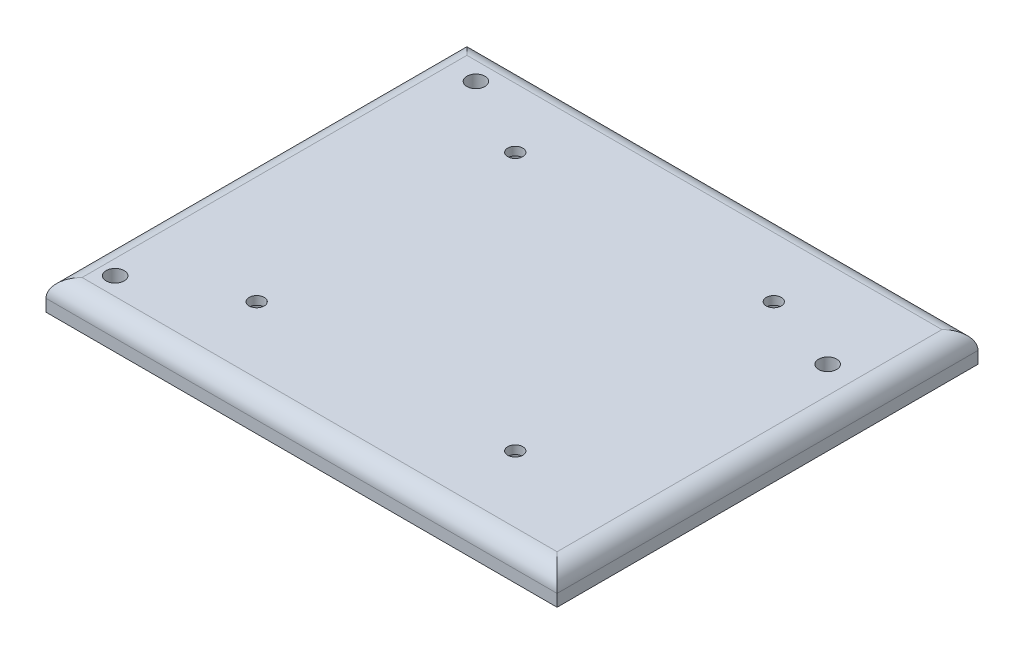
ISO-10303-21;
HEADER;
FILE_DESCRIPTION(('STEP AP214'),'2;1');
FILE_NAME('part.step','',(''),(''),'','','');
FILE_SCHEMA(('AUTOMOTIVE_DESIGN { 1 0 10303 214 1 1 1 1 }'));
ENDSEC;
DATA;
#1=APPLICATION_CONTEXT('core data for automotive mechanical design processes');
#2=APPLICATION_PROTOCOL_DEFINITION('international standard','automotive_design',2000,#1);
#3=PRODUCT_CONTEXT('',#1,'mechanical');
#4=PRODUCT('Part','Part','',(#3));
#5=PRODUCT_RELATED_PRODUCT_CATEGORY('part','',(#4));
#6=PRODUCT_DEFINITION_FORMATION('','',#4);
#7=PRODUCT_DEFINITION_CONTEXT('part definition',#1,'design');
#8=PRODUCT_DEFINITION('design','',#6,#7);
#9=PRODUCT_DEFINITION_SHAPE('','',#8);
#10=(LENGTH_UNIT() NAMED_UNIT(*) SI_UNIT(.MILLI.,.METRE.));
#11=(NAMED_UNIT(*) PLANE_ANGLE_UNIT() SI_UNIT($,.RADIAN.));
#12=(NAMED_UNIT(*) SI_UNIT($,.STERADIAN.) SOLID_ANGLE_UNIT());
#13=UNCERTAINTY_MEASURE_WITH_UNIT(LENGTH_MEASURE(1.E-05),#10,'distance_accuracy_value','');
#14=(GEOMETRIC_REPRESENTATION_CONTEXT(3) GLOBAL_UNCERTAINTY_ASSIGNED_CONTEXT((#13)) GLOBAL_UNIT_ASSIGNED_CONTEXT((#10,
#11,#12)) REPRESENTATION_CONTEXT('',''));
#15=CARTESIAN_POINT('',(0.,0.,0.));
#16=DIRECTION('',(0.,0.,1.));
#17=DIRECTION('',(1.,0.,0.));
#18=AXIS2_PLACEMENT_3D('',#15,#16,#17);
#19=CARTESIAN_POINT('',(-21.5,-0.00100000000000013,-22.0371967851248));
#20=DIRECTION('',(0.,1.,0.));
#21=DIRECTION('',(0.,0.,1.));
#22=AXIS2_PLACEMENT_3D('',#19,#20,#21);
#23=CYLINDRICAL_SURFACE('',#22,1.25);
#24=CARTESIAN_POINT('',(-21.5,5.,-22.0371967851248));
#25=DIRECTION('',(0.,1.,0.));
#26=DIRECTION('',(0.,0.,1.));
#27=AXIS2_PLACEMENT_3D('',#24,#25,#26);
#28=CIRCLE('',#27,1.25);
#29=CARTESIAN_POINT('',(-21.5,5.,-20.7871967851248));
#30=VERTEX_POINT('',#29);
#31=EDGE_CURVE('E228',#30,#30,#28,.T.);
#32=ORIENTED_EDGE('',*,*,#31,.T.);
#33=EDGE_LOOP('',(#32));
#34=FACE_BOUND('',#33,.T.);
#35=CARTESIAN_POINT('',(-21.5,3.6,-22.0371967851248));
#36=DIRECTION('',(0.,-1.,0.));
#37=DIRECTION('',(0.,0.,-1.));
#38=AXIS2_PLACEMENT_3D('',#35,#36,#37);
#39=CIRCLE('',#38,1.25);
#40=CARTESIAN_POINT('',(-21.5,3.6,-23.2871967851248));
#41=VERTEX_POINT('',#40);
#42=EDGE_CURVE('E156',#41,#41,#39,.F.);
#43=ORIENTED_EDGE('',*,*,#42,.F.);
#44=EDGE_LOOP('',(#43));
#45=FACE_BOUND('',#44,.T.);
#46=ADVANCED_FACE('F47',(#34,#45),#23,.F.);
#47=CARTESIAN_POINT('',(21.5,-0.00100000000000013,20.9628032148752));
#48=DIRECTION('',(0.,1.,0.));
#49=DIRECTION('',(0.,0.,1.));
#50=AXIS2_PLACEMENT_3D('',#47,#48,#49);
#51=CYLINDRICAL_SURFACE('',#50,1.25);
#52=CARTESIAN_POINT('',(21.5,5.,20.9628032148752));
#53=DIRECTION('',(0.,1.,0.));
#54=DIRECTION('',(0.,0.,1.));
#55=AXIS2_PLACEMENT_3D('',#52,#53,#54);
#56=CIRCLE('',#55,1.25);
#57=CARTESIAN_POINT('',(21.5,5.,22.2128032148752));
#58=VERTEX_POINT('',#57);
#59=EDGE_CURVE('E160',#58,#58,#56,.T.);
#60=ORIENTED_EDGE('',*,*,#59,.T.);
#61=EDGE_LOOP('',(#60));
#62=FACE_BOUND('',#61,.T.);
#63=CARTESIAN_POINT('',(21.5,3.6,20.9628032148752));
#64=DIRECTION('',(0.,-1.,0.));
#65=DIRECTION('',(0.,0.,-1.));
#66=AXIS2_PLACEMENT_3D('',#63,#64,#65);
#67=CIRCLE('',#66,1.25);
#68=CARTESIAN_POINT('',(21.5,3.6,19.7128032148752));
#69=VERTEX_POINT('',#68);
#70=EDGE_CURVE('E152',#69,#69,#67,.F.);
#71=ORIENTED_EDGE('',*,*,#70,.F.);
#72=EDGE_LOOP('',(#71));
#73=FACE_BOUND('',#72,.T.);
#74=ADVANCED_FACE('F271',(#62,#73),#51,.F.);
#75=CARTESIAN_POINT('',(-21.5,-0.00100000000000013,20.9628032148752));
#76=DIRECTION('',(0.,1.,0.));
#77=DIRECTION('',(0.,0.,1.));
#78=AXIS2_PLACEMENT_3D('',#75,#76,#77);
#79=CYLINDRICAL_SURFACE('',#78,1.25);
#80=CARTESIAN_POINT('',(-21.5,5.,20.9628032148752));
#81=DIRECTION('',(0.,1.,0.));
#82=DIRECTION('',(0.,0.,-1.));
#83=AXIS2_PLACEMENT_3D('',#80,#81,#82);
#84=CIRCLE('',#83,1.25);
#85=CARTESIAN_POINT('',(-21.5,5.,19.7128032148752));
#86=VERTEX_POINT('',#85);
#87=EDGE_CURVE('E223',#86,#86,#84,.T.);
#88=ORIENTED_EDGE('',*,*,#87,.T.);
#89=EDGE_LOOP('',(#88));
#90=FACE_BOUND('',#89,.T.);
#91=CARTESIAN_POINT('',(-21.5,3.6,20.9628032148752));
#92=DIRECTION('',(0.,-1.,0.));
#93=DIRECTION('',(0.,0.,-1.));
#94=AXIS2_PLACEMENT_3D('',#91,#92,#93);
#95=CIRCLE('',#94,1.25);
#96=CARTESIAN_POINT('',(-21.5,3.6,19.7128032148752));
#97=VERTEX_POINT('',#96);
#98=EDGE_CURVE('E147',#97,#97,#95,.F.);
#99=ORIENTED_EDGE('',*,*,#98,.F.);
#100=EDGE_LOOP('',(#99));
#101=FACE_BOUND('',#100,.T.);
#102=ADVANCED_FACE('F277',(#90,#101),#79,.F.);
#103=CARTESIAN_POINT('',(21.5,-0.00100000000000013,-22.0371967851248));
#104=DIRECTION('',(0.,1.,0.));
#105=DIRECTION('',(0.,0.,1.));
#106=AXIS2_PLACEMENT_3D('',#103,#104,#105);
#107=CYLINDRICAL_SURFACE('',#106,1.25);
#108=CARTESIAN_POINT('',(21.5,5.,-22.0371967851248));
#109=DIRECTION('',(0.,1.,0.));
#110=DIRECTION('',(0.,0.,-1.));
#111=AXIS2_PLACEMENT_3D('',#108,#109,#110);
#112=CIRCLE('',#111,1.25);
#113=CARTESIAN_POINT('',(21.5,5.,-23.2871967851248));
#114=VERTEX_POINT('',#113);
#115=EDGE_CURVE('E224',#114,#114,#112,.T.);
#116=ORIENTED_EDGE('',*,*,#115,.T.);
#117=EDGE_LOOP('',(#116));
#118=FACE_BOUND('',#117,.T.);
#119=CARTESIAN_POINT('',(21.5,3.6,-22.0371967851248));
#120=DIRECTION('',(0.,-1.,0.));
#121=DIRECTION('',(0.,0.,-1.));
#122=AXIS2_PLACEMENT_3D('',#119,#120,#121);
#123=CIRCLE('',#122,1.25);
#124=CARTESIAN_POINT('',(21.5,3.6,-23.2871967851248));
#125=VERTEX_POINT('',#124);
#126=EDGE_CURVE('E143',#125,#125,#123,.F.);
#127=ORIENTED_EDGE('',*,*,#126,.F.);
#128=EDGE_LOOP('',(#127));
#129=FACE_BOUND('',#128,.T.);
#130=ADVANCED_FACE('F284',(#118,#129),#107,.F.);
#131=CARTESIAN_POINT('',(0.,5.,0.));
#132=DIRECTION('',(0.,1.,0.));
#133=DIRECTION('',(0.,0.,1.));
#134=AXIS2_PLACEMENT_3D('',#131,#132,#133);
#135=PLANE('',#134);
#136=DIRECTION('',(1.,0.,0.));
#137=VECTOR('',#136,1.);
#138=CARTESIAN_POINT('',(42.5,5.,32.));
#139=LINE('',#138,#137);
#140=CARTESIAN_POINT('',(-39.5,5.,32.));
#141=VERTEX_POINT('',#140);
#142=CARTESIAN_POINT('',(39.5,5.,32.));
#143=VERTEX_POINT('',#142);
#144=EDGE_CURVE('E106',#141,#143,#139,.T.);
#145=ORIENTED_EDGE('',*,*,#144,.T.);
#146=DIRECTION('',(0.,0.,-1.));
#147=VECTOR('',#146,1.);
#148=CARTESIAN_POINT('',(39.5,5.,-35.));
#149=LINE('',#148,#147);
#150=CARTESIAN_POINT('',(39.5,5.,-32.));
#151=VERTEX_POINT('',#150);
#152=EDGE_CURVE('E169',#143,#151,#149,.T.);
#153=ORIENTED_EDGE('',*,*,#152,.T.);
#154=DIRECTION('',(-1.,0.,0.));
#155=VECTOR('',#154,1.);
#156=CARTESIAN_POINT('',(-42.5,5.,-32.));
#157=LINE('',#156,#155);
#158=CARTESIAN_POINT('',(-39.5,5.,-32.));
#159=VERTEX_POINT('',#158);
#160=EDGE_CURVE('E166',#151,#159,#157,.T.);
#161=ORIENTED_EDGE('',*,*,#160,.T.);
#162=DIRECTION('',(0.,0.,1.));
#163=VECTOR('',#162,1.);
#164=CARTESIAN_POINT('',(-39.5,5.,35.));
#165=LINE('',#164,#163);
#166=EDGE_CURVE('E163',#159,#141,#165,.T.);
#167=ORIENTED_EDGE('',*,*,#166,.T.);
#168=EDGE_LOOP('',(#145,#153,#161,#167));
#169=FACE_BOUND('',#168,.T.);
#170=ORIENTED_EDGE('',*,*,#115,.F.);
#171=EDGE_LOOP('',(#170));
#172=FACE_BOUND('',#171,.T.);
#173=ORIENTED_EDGE('',*,*,#87,.F.);
#174=EDGE_LOOP('',(#173));
#175=FACE_BOUND('',#174,.T.);
#176=ORIENTED_EDGE('',*,*,#59,.F.);
#177=EDGE_LOOP('',(#176));
#178=FACE_BOUND('',#177,.T.);
#179=ORIENTED_EDGE('',*,*,#31,.F.);
#180=EDGE_LOOP('',(#179));
#181=FACE_BOUND('',#180,.T.);
#182=CARTESIAN_POINT('',(-37.,5.,29.));
#183=DIRECTION('',(0.,1.,0.));
#184=DIRECTION('',(0.,0.,1.));
#185=AXIS2_PLACEMENT_3D('',#182,#183,#184);
#186=CIRCLE('',#185,1.5);
#187=CARTESIAN_POINT('',(-37.,5.,30.5));
#188=VERTEX_POINT('',#187);
#189=EDGE_CURVE('E244',#188,#188,#186,.T.);
#190=ORIENTED_EDGE('',*,*,#189,.F.);
#191=EDGE_LOOP('',(#190));
#192=FACE_BOUND('',#191,.T.);
#193=CARTESIAN_POINT('',(-35.,5.,-29.));
#194=DIRECTION('',(0.,1.,0.));
#195=DIRECTION('',(0.,0.,1.));
#196=AXIS2_PLACEMENT_3D('',#193,#194,#195);
#197=CIRCLE('',#196,1.5);
#198=CARTESIAN_POINT('',(-35.,5.,-27.5));
#199=VERTEX_POINT('',#198);
#200=EDGE_CURVE('E123',#199,#199,#197,.T.);
#201=ORIENTED_EDGE('',*,*,#200,.F.);
#202=EDGE_LOOP('',(#201));
#203=FACE_BOUND('',#202,.T.);
#204=CARTESIAN_POINT('',(35.,5.,-17.5));
#205=DIRECTION('',(0.,1.,0.));
#206=DIRECTION('',(0.,0.,1.));
#207=AXIS2_PLACEMENT_3D('',#204,#205,#206);
#208=CIRCLE('',#207,1.5);
#209=CARTESIAN_POINT('',(35.,5.,-16.));
#210=VERTEX_POINT('',#209);
#211=EDGE_CURVE('E236',#210,#210,#208,.T.);
#212=ORIENTED_EDGE('',*,*,#211,.F.);
#213=EDGE_LOOP('',(#212));
#214=FACE_BOUND('',#213,.T.);
#215=ADVANCED_FACE('F287',(#169,#172,#175,#178,#181,#192,#203,#214),#135,.T.);
#216=CARTESIAN_POINT('',(0.,0.,0.));
#217=DIRECTION('',(0.,1.,0.));
#218=DIRECTION('',(0.,0.,1.));
#219=AXIS2_PLACEMENT_3D('',#216,#217,#218);
#220=PLANE('',#219);
#221=CARTESIAN_POINT('',(-21.5,0.,-22.0371967851248));
#222=DIRECTION('',(0.,-1.,0.));
#223=DIRECTION('',(0.,0.,-1.));
#224=AXIS2_PLACEMENT_3D('',#221,#222,#223);
#225=CIRCLE('',#224,3.);
#226=CARTESIAN_POINT('',(-21.5,0.,-25.0371967851248));
#227=VERTEX_POINT('',#226);
#228=EDGE_CURVE('E202',#227,#227,#225,.T.);
#229=ORIENTED_EDGE('',*,*,#228,.F.);
#230=EDGE_LOOP('',(#229));
#231=FACE_BOUND('',#230,.T.);
#232=CARTESIAN_POINT('',(21.5,0.,-22.0371967851248));
#233=DIRECTION('',(0.,-1.,0.));
#234=DIRECTION('',(0.,0.,-1.));
#235=AXIS2_PLACEMENT_3D('',#232,#233,#234);
#236=CIRCLE('',#235,3.);
#237=CARTESIAN_POINT('',(21.5,0.,-25.0371967851248));
#238=VERTEX_POINT('',#237);
#239=EDGE_CURVE('E331',#238,#238,#236,.T.);
#240=ORIENTED_EDGE('',*,*,#239,.F.);
#241=EDGE_LOOP('',(#240));
#242=FACE_BOUND('',#241,.T.);
#243=CARTESIAN_POINT('',(21.5,0.,20.9628032148752));
#244=DIRECTION('',(0.,-1.,0.));
#245=DIRECTION('',(0.,0.,-1.));
#246=AXIS2_PLACEMENT_3D('',#243,#244,#245);
#247=CIRCLE('',#246,3.);
#248=CARTESIAN_POINT('',(21.5,0.,17.9628032148752));
#249=VERTEX_POINT('',#248);
#250=EDGE_CURVE('E219',#249,#249,#247,.T.);
#251=ORIENTED_EDGE('',*,*,#250,.F.);
#252=EDGE_LOOP('',(#251));
#253=FACE_BOUND('',#252,.T.);
#254=CARTESIAN_POINT('',(-21.5,0.,20.9628032148752));
#255=DIRECTION('',(0.,-1.,0.));
#256=DIRECTION('',(0.,0.,-1.));
#257=AXIS2_PLACEMENT_3D('',#254,#255,#256);
#258=CIRCLE('',#257,3.);
#259=CARTESIAN_POINT('',(-21.5,0.,17.9628032148752));
#260=VERTEX_POINT('',#259);
#261=EDGE_CURVE('E215',#260,#260,#258,.T.);
#262=ORIENTED_EDGE('',*,*,#261,.F.);
#263=EDGE_LOOP('',(#262));
#264=FACE_BOUND('',#263,.T.);
#265=DIRECTION('',(0.,0.,1.));
#266=VECTOR('',#265,1.);
#267=CARTESIAN_POINT('',(-42.5,0.,35.));
#268=LINE('',#267,#266);
#269=CARTESIAN_POINT('',(-42.5,0.,-35.));
#270=VERTEX_POINT('',#269);
#271=CARTESIAN_POINT('',(-42.5,0.,35.));
#272=VERTEX_POINT('',#271);
#273=EDGE_CURVE('E114',#270,#272,#268,.T.);
#274=ORIENTED_EDGE('',*,*,#273,.F.);
#275=DIRECTION('',(-1.,0.,0.));
#276=VECTOR('',#275,1.);
#277=CARTESIAN_POINT('',(42.5,0.,-35.));
#278=LINE('',#277,#276);
#279=CARTESIAN_POINT('',(42.5,0.,-35.));
#280=VERTEX_POINT('',#279);
#281=EDGE_CURVE('E133',#280,#270,#278,.T.);
#282=ORIENTED_EDGE('',*,*,#281,.F.);
#283=DIRECTION('',(0.,0.,-1.));
#284=VECTOR('',#283,1.);
#285=CARTESIAN_POINT('',(42.5,0.,35.));
#286=LINE('',#285,#284);
#287=CARTESIAN_POINT('',(42.5,0.,35.));
#288=VERTEX_POINT('',#287);
#289=EDGE_CURVE('E116',#288,#280,#286,.T.);
#290=ORIENTED_EDGE('',*,*,#289,.F.);
#291=DIRECTION('',(1.,0.,0.));
#292=VECTOR('',#291,1.);
#293=CARTESIAN_POINT('',(42.5,0.,35.));
#294=LINE('',#293,#292);
#295=EDGE_CURVE('E102',#272,#288,#294,.T.);
#296=ORIENTED_EDGE('',*,*,#295,.F.);
#297=EDGE_LOOP('',(#274,#282,#290,#296));
#298=FACE_BOUND('',#297,.T.);
#299=CARTESIAN_POINT('',(-35.,0.,-29.));
#300=DIRECTION('',(0.,1.,0.));
#301=DIRECTION('',(0.,0.,1.));
#302=AXIS2_PLACEMENT_3D('',#299,#300,#301);
#303=CIRCLE('',#302,1.5);
#304=CARTESIAN_POINT('',(-35.,0.,-27.5));
#305=VERTEX_POINT('',#304);
#306=EDGE_CURVE('E127',#305,#305,#303,.T.);
#307=ORIENTED_EDGE('',*,*,#306,.T.);
#308=EDGE_LOOP('',(#307));
#309=FACE_BOUND('',#308,.T.);
#310=CARTESIAN_POINT('',(-37.,0.,29.));
#311=DIRECTION('',(0.,1.,0.));
#312=DIRECTION('',(0.,0.,1.));
#313=AXIS2_PLACEMENT_3D('',#310,#311,#312);
#314=CIRCLE('',#313,1.5);
#315=CARTESIAN_POINT('',(-37.,0.,30.5));
#316=VERTEX_POINT('',#315);
#317=EDGE_CURVE('E240',#316,#316,#314,.T.);
#318=ORIENTED_EDGE('',*,*,#317,.T.);
#319=EDGE_LOOP('',(#318));
#320=FACE_BOUND('',#319,.T.);
#321=CARTESIAN_POINT('',(35.,0.,-17.5));
#322=DIRECTION('',(0.,1.,0.));
#323=DIRECTION('',(0.,0.,1.));
#324=AXIS2_PLACEMENT_3D('',#321,#322,#323);
#325=CIRCLE('',#324,1.5);
#326=CARTESIAN_POINT('',(35.,0.,-16.));
#327=VERTEX_POINT('',#326);
#328=EDGE_CURVE('E235',#327,#327,#325,.T.);
#329=ORIENTED_EDGE('',*,*,#328,.T.);
#330=EDGE_LOOP('',(#329));
#331=FACE_BOUND('',#330,.T.);
#332=ADVANCED_FACE('F111',(#231,#242,#253,#264,#298,#309,#320,#331),#220,.F.);
#333=CARTESIAN_POINT('',(-42.5,5.,35.));
#334=DIRECTION('',(1.,0.,0.));
#335=DIRECTION('',(0.,0.,-1.));
#336=AXIS2_PLACEMENT_3D('',#333,#334,#335);
#337=PLANE('',#336);
#338=DIRECTION('',(0.,-1.,0.));
#339=VECTOR('',#338,1.);
#340=CARTESIAN_POINT('',(-42.5,5.,35.));
#341=LINE('',#340,#339);
#342=CARTESIAN_POINT('',(-42.5,2.,35.));
#343=VERTEX_POINT('',#342);
#344=EDGE_CURVE('E99',#343,#272,#341,.T.);
#345=ORIENTED_EDGE('',*,*,#344,.F.);
#346=DIRECTION('',(0.,0.,1.));
#347=VECTOR('',#346,1.);
#348=CARTESIAN_POINT('',(-42.5,2.,-35.));
#349=LINE('',#348,#347);
#350=CARTESIAN_POINT('',(-42.5,2.,-35.));
#351=VERTEX_POINT('',#350);
#352=EDGE_CURVE('E57',#343,#351,#349,.F.);
#353=ORIENTED_EDGE('',*,*,#352,.T.);
#354=DIRECTION('',(0.,-1.,0.));
#355=VECTOR('',#354,1.);
#356=CARTESIAN_POINT('',(-42.5,5.,-35.));
#357=LINE('',#356,#355);
#358=EDGE_CURVE('E120',#351,#270,#357,.T.);
#359=ORIENTED_EDGE('',*,*,#358,.T.);
#360=ORIENTED_EDGE('',*,*,#273,.T.);
#361=EDGE_LOOP('',(#345,#353,#359,#360));
#362=FACE_BOUND('',#361,.T.);
#363=ADVANCED_FACE('F119',(#362),#337,.F.);
#364=CARTESIAN_POINT('',(42.5,5.,35.));
#365=DIRECTION('',(0.,0.,-1.));
#366=DIRECTION('',(-1.,0.,0.));
#367=AXIS2_PLACEMENT_3D('',#364,#365,#366);
#368=PLANE('',#367);
#369=DIRECTION('',(0.,-1.,0.));
#370=VECTOR('',#369,1.);
#371=CARTESIAN_POINT('',(42.5,5.,35.));
#372=LINE('',#371,#370);
#373=CARTESIAN_POINT('',(42.5,2.,35.));
#374=VERTEX_POINT('',#373);
#375=EDGE_CURVE('E107',#374,#288,#372,.T.);
#376=ORIENTED_EDGE('',*,*,#375,.F.);
#377=DIRECTION('',(1.,0.,0.));
#378=VECTOR('',#377,1.);
#379=CARTESIAN_POINT('',(-42.5,2.,35.));
#380=LINE('',#379,#378);
#381=EDGE_CURVE('E11',#374,#343,#380,.F.);
#382=ORIENTED_EDGE('',*,*,#381,.T.);
#383=ORIENTED_EDGE('',*,*,#344,.T.);
#384=ORIENTED_EDGE('',*,*,#295,.T.);
#385=EDGE_LOOP('',(#376,#382,#383,#384));
#386=FACE_BOUND('',#385,.T.);
#387=ADVANCED_FACE('F101',(#386),#368,.F.);
#388=CARTESIAN_POINT('',(42.5,5.,35.));
#389=DIRECTION('',(-1.,0.,0.));
#390=DIRECTION('',(0.,0.,1.));
#391=AXIS2_PLACEMENT_3D('',#388,#389,#390);
#392=PLANE('',#391);
#393=DIRECTION('',(0.,-1.,0.));
#394=VECTOR('',#393,1.);
#395=CARTESIAN_POINT('',(42.5,5.,-35.));
#396=LINE('',#395,#394);
#397=CARTESIAN_POINT('',(42.5,2.,-35.));
#398=VERTEX_POINT('',#397);
#399=EDGE_CURVE('E138',#398,#280,#396,.T.);
#400=ORIENTED_EDGE('',*,*,#399,.F.);
#401=DIRECTION('',(0.,0.,-1.));
#402=VECTOR('',#401,1.);
#403=CARTESIAN_POINT('',(42.5,2.,35.));
#404=LINE('',#403,#402);
#405=EDGE_CURVE('E173',#398,#374,#404,.F.);
#406=ORIENTED_EDGE('',*,*,#405,.T.);
#407=ORIENTED_EDGE('',*,*,#375,.T.);
#408=ORIENTED_EDGE('',*,*,#289,.T.);
#409=EDGE_LOOP('',(#400,#406,#407,#408));
#410=FACE_BOUND('',#409,.T.);
#411=ADVANCED_FACE('F360',(#410),#392,.F.);
#412=CARTESIAN_POINT('',(42.5,5.,-35.));
#413=DIRECTION('',(0.,0.,1.));
#414=DIRECTION('',(1.,0.,0.));
#415=AXIS2_PLACEMENT_3D('',#412,#413,#414);
#416=PLANE('',#415);
#417=ORIENTED_EDGE('',*,*,#358,.F.);
#418=DIRECTION('',(-1.,0.,0.));
#419=VECTOR('',#418,1.);
#420=CARTESIAN_POINT('',(42.5,2.,-35.));
#421=LINE('',#420,#419);
#422=EDGE_CURVE('E177',#351,#398,#421,.F.);
#423=ORIENTED_EDGE('',*,*,#422,.T.);
#424=ORIENTED_EDGE('',*,*,#399,.T.);
#425=ORIENTED_EDGE('',*,*,#281,.T.);
#426=EDGE_LOOP('',(#417,#423,#424,#425));
#427=FACE_BOUND('',#426,.T.);
#428=ADVANCED_FACE('F267',(#427),#416,.F.);
#429=CARTESIAN_POINT('',(-35.,5.,-29.));
#430=DIRECTION('',(0.,-1.,0.));
#431=DIRECTION('',(0.,0.,-1.));
#432=AXIS2_PLACEMENT_3D('',#429,#430,#431);
#433=CYLINDRICAL_SURFACE('',#432,1.5);
#434=ORIENTED_EDGE('',*,*,#200,.T.);
#435=EDGE_LOOP('',(#434));
#436=FACE_BOUND('',#435,.T.);
#437=ORIENTED_EDGE('',*,*,#306,.F.);
#438=EDGE_LOOP('',(#437));
#439=FACE_BOUND('',#438,.T.);
#440=ADVANCED_FACE('F257',(#436,#439),#433,.F.);
#441=CARTESIAN_POINT('',(-37.,5.,29.));
#442=DIRECTION('',(0.,-1.,0.));
#443=DIRECTION('',(0.,0.,-1.));
#444=AXIS2_PLACEMENT_3D('',#441,#442,#443);
#445=CYLINDRICAL_SURFACE('',#444,1.5);
#446=ORIENTED_EDGE('',*,*,#189,.T.);
#447=EDGE_LOOP('',(#446));
#448=FACE_BOUND('',#447,.T.);
#449=ORIENTED_EDGE('',*,*,#317,.F.);
#450=EDGE_LOOP('',(#449));
#451=FACE_BOUND('',#450,.T.);
#452=ADVANCED_FACE('F254',(#448,#451),#445,.F.);
#453=CARTESIAN_POINT('',(35.,5.,-17.5));
#454=DIRECTION('',(0.,-1.,0.));
#455=DIRECTION('',(0.,0.,-1.));
#456=AXIS2_PLACEMENT_3D('',#453,#454,#455);
#457=CYLINDRICAL_SURFACE('',#456,1.5);
#458=ORIENTED_EDGE('',*,*,#211,.T.);
#459=EDGE_LOOP('',(#458));
#460=FACE_BOUND('',#459,.T.);
#461=ORIENTED_EDGE('',*,*,#328,.F.);
#462=EDGE_LOOP('',(#461));
#463=FACE_BOUND('',#462,.T.);
#464=ADVANCED_FACE('F256',(#460,#463),#457,.F.);
#465=CARTESIAN_POINT('',(21.5,3.6,-22.0371967851248));
#466=DIRECTION('',(0.,-1.,0.));
#467=DIRECTION('',(0.,0.,-1.));
#468=AXIS2_PLACEMENT_3D('',#465,#466,#467);
#469=PLANE('',#468);
#470=CARTESIAN_POINT('',(21.5,3.6,-22.0371967851248));
#471=DIRECTION('',(0.,-1.,0.));
#472=DIRECTION('',(0.,0.,-1.));
#473=AXIS2_PLACEMENT_3D('',#470,#471,#472);
#474=CIRCLE('',#473,3.);
#475=CARTESIAN_POINT('',(21.5,3.6,-25.0371967851248));
#476=VERTEX_POINT('',#475);
#477=EDGE_CURVE('E208',#476,#476,#474,.T.);
#478=ORIENTED_EDGE('',*,*,#477,.T.);
#479=EDGE_LOOP('',(#478));
#480=FACE_BOUND('',#479,.T.);
#481=ORIENTED_EDGE('',*,*,#126,.T.);
#482=EDGE_LOOP('',(#481));
#483=FACE_BOUND('',#482,.T.);
#484=ADVANCED_FACE('F264',(#480,#483),#469,.T.);
#485=CARTESIAN_POINT('',(21.5,3.6,-22.0371967851248));
#486=DIRECTION('',(0.,-1.,0.));
#487=DIRECTION('',(0.,0.,-1.));
#488=AXIS2_PLACEMENT_3D('',#485,#486,#487);
#489=CYLINDRICAL_SURFACE('',#488,3.);
#490=ORIENTED_EDGE('',*,*,#477,.F.);
#491=EDGE_LOOP('',(#490));
#492=FACE_BOUND('',#491,.T.);
#493=ORIENTED_EDGE('',*,*,#239,.T.);
#494=EDGE_LOOP('',(#493));
#495=FACE_BOUND('',#494,.T.);
#496=ADVANCED_FACE('F298',(#492,#495),#489,.F.);
#497=CARTESIAN_POINT('',(-21.5,3.6,20.9628032148752));
#498=DIRECTION('',(0.,-1.,0.));
#499=DIRECTION('',(0.,0.,-1.));
#500=AXIS2_PLACEMENT_3D('',#497,#498,#499);
#501=PLANE('',#500);
#502=CARTESIAN_POINT('',(-21.5,3.6,20.9628032148752));
#503=DIRECTION('',(0.,-1.,0.));
#504=DIRECTION('',(0.,0.,-1.));
#505=AXIS2_PLACEMENT_3D('',#502,#503,#504);
#506=CIRCLE('',#505,3.);
#507=CARTESIAN_POINT('',(-21.5,3.6,17.9628032148752));
#508=VERTEX_POINT('',#507);
#509=EDGE_CURVE('E148',#508,#508,#506,.T.);
#510=ORIENTED_EDGE('',*,*,#509,.T.);
#511=EDGE_LOOP('',(#510));
#512=FACE_BOUND('',#511,.T.);
#513=ORIENTED_EDGE('',*,*,#98,.T.);
#514=EDGE_LOOP('',(#513));
#515=FACE_BOUND('',#514,.T.);
#516=ADVANCED_FACE('F294',(#512,#515),#501,.T.);
#517=CARTESIAN_POINT('',(-21.5,3.6,20.9628032148752));
#518=DIRECTION('',(0.,-1.,0.));
#519=DIRECTION('',(0.,0.,-1.));
#520=AXIS2_PLACEMENT_3D('',#517,#518,#519);
#521=CYLINDRICAL_SURFACE('',#520,3.);
#522=ORIENTED_EDGE('',*,*,#509,.F.);
#523=EDGE_LOOP('',(#522));
#524=FACE_BOUND('',#523,.T.);
#525=ORIENTED_EDGE('',*,*,#261,.T.);
#526=EDGE_LOOP('',(#525));
#527=FACE_BOUND('',#526,.T.);
#528=ADVANCED_FACE('F290',(#524,#527),#521,.F.);
#529=CARTESIAN_POINT('',(21.5,3.6,20.9628032148752));
#530=DIRECTION('',(0.,-1.,0.));
#531=DIRECTION('',(0.,0.,-1.));
#532=AXIS2_PLACEMENT_3D('',#529,#530,#531);
#533=PLANE('',#532);
#534=CARTESIAN_POINT('',(21.5,3.6,20.9628032148752));
#535=DIRECTION('',(0.,-1.,0.));
#536=DIRECTION('',(0.,0.,-1.));
#537=AXIS2_PLACEMENT_3D('',#534,#535,#536);
#538=CIRCLE('',#537,3.);
#539=CARTESIAN_POINT('',(21.5,3.6,17.9628032148752));
#540=VERTEX_POINT('',#539);
#541=EDGE_CURVE('E324',#540,#540,#538,.T.);
#542=ORIENTED_EDGE('',*,*,#541,.T.);
#543=EDGE_LOOP('',(#542));
#544=FACE_BOUND('',#543,.T.);
#545=ORIENTED_EDGE('',*,*,#70,.T.);
#546=EDGE_LOOP('',(#545));
#547=FACE_BOUND('',#546,.T.);
#548=ADVANCED_FACE('F293',(#544,#547),#533,.T.);
#549=CARTESIAN_POINT('',(21.5,3.6,20.9628032148752));
#550=DIRECTION('',(0.,-1.,0.));
#551=DIRECTION('',(0.,0.,-1.));
#552=AXIS2_PLACEMENT_3D('',#549,#550,#551);
#553=CYLINDRICAL_SURFACE('',#552,3.);
#554=ORIENTED_EDGE('',*,*,#541,.F.);
#555=EDGE_LOOP('',(#554));
#556=FACE_BOUND('',#555,.T.);
#557=ORIENTED_EDGE('',*,*,#250,.T.);
#558=EDGE_LOOP('',(#557));
#559=FACE_BOUND('',#558,.T.);
#560=ADVANCED_FACE('F304',(#556,#559),#553,.F.);
#561=CARTESIAN_POINT('',(-21.5,3.6,-22.0371967851248));
#562=DIRECTION('',(0.,-1.,0.));
#563=DIRECTION('',(0.,0.,-1.));
#564=AXIS2_PLACEMENT_3D('',#561,#562,#563);
#565=PLANE('',#564);
#566=CARTESIAN_POINT('',(-21.5,3.6,-22.0371967851248));
#567=DIRECTION('',(0.,-1.,0.));
#568=DIRECTION('',(0.,0.,-1.));
#569=AXIS2_PLACEMENT_3D('',#566,#567,#568);
#570=CIRCLE('',#569,3.);
#571=CARTESIAN_POINT('',(-21.5,3.6,-25.0371967851248));
#572=VERTEX_POINT('',#571);
#573=EDGE_CURVE('E196',#572,#572,#570,.T.);
#574=ORIENTED_EDGE('',*,*,#573,.T.);
#575=EDGE_LOOP('',(#574));
#576=FACE_BOUND('',#575,.T.);
#577=ORIENTED_EDGE('',*,*,#42,.T.);
#578=EDGE_LOOP('',(#577));
#579=FACE_BOUND('',#578,.T.);
#580=ADVANCED_FACE('F300',(#576,#579),#565,.T.);
#581=CARTESIAN_POINT('',(-21.5,3.6,-22.0371967851248));
#582=DIRECTION('',(0.,-1.,0.));
#583=DIRECTION('',(0.,0.,-1.));
#584=AXIS2_PLACEMENT_3D('',#581,#582,#583);
#585=CYLINDRICAL_SURFACE('',#584,3.);
#586=ORIENTED_EDGE('',*,*,#573,.F.);
#587=EDGE_LOOP('',(#586));
#588=FACE_BOUND('',#587,.T.);
#589=ORIENTED_EDGE('',*,*,#228,.T.);
#590=EDGE_LOOP('',(#589));
#591=FACE_BOUND('',#590,.T.);
#592=ADVANCED_FACE('F303',(#588,#591),#585,.F.);
#593=CARTESIAN_POINT('',(-39.5,2.,0.));
#594=DIRECTION('',(0.,0.,-1.));
#595=DIRECTION('',(-1.,0.,0.));
#596=AXIS2_PLACEMENT_3D('',#593,#594,#595);
#597=CYLINDRICAL_SURFACE('',#596,3.);
#598=CARTESIAN_POINT('',(-39.5,2.,-32.));
#599=DIRECTION('',(0.707106781186547,0.,-0.707106781186548));
#600=DIRECTION('',(-0.707106781186548,0.,-0.707106781186547));
#601=AXIS2_PLACEMENT_3D('',#598,#599,#600);
#602=ELLIPSE('',#601,4.24264068711928,3.);
#603=EDGE_CURVE('E187',#351,#159,#602,.T.);
#604=ORIENTED_EDGE('',*,*,#603,.F.);
#605=ORIENTED_EDGE('',*,*,#352,.F.);
#606=CARTESIAN_POINT('',(-39.5,2.,32.));
#607=DIRECTION('',(-0.707106781186548,0.,-0.707106781186547));
#608=DIRECTION('',(-0.707106781186547,0.,0.707106781186548));
#609=AXIS2_PLACEMENT_3D('',#606,#607,#608);
#610=ELLIPSE('',#609,4.24264068711929,3.);
#611=EDGE_CURVE('E51',#141,#343,#610,.F.);
#612=ORIENTED_EDGE('',*,*,#611,.F.);
#613=ORIENTED_EDGE('',*,*,#166,.F.);
#614=EDGE_LOOP('',(#604,#605,#612,#613));
#615=FACE_BOUND('',#614,.T.);
#616=ADVANCED_FACE('F49',(#615),#597,.T.);
#617=CARTESIAN_POINT('',(0.,2.,32.));
#618=DIRECTION('',(-1.,0.,0.));
#619=DIRECTION('',(0.,0.,1.));
#620=AXIS2_PLACEMENT_3D('',#617,#618,#619);
#621=CYLINDRICAL_SURFACE('',#620,3.);
#622=ORIENTED_EDGE('',*,*,#611,.T.);
#623=ORIENTED_EDGE('',*,*,#381,.F.);
#624=CARTESIAN_POINT('',(39.5,2.,32.));
#625=DIRECTION('',(-0.707106781186547,0.,0.707106781186548));
#626=DIRECTION('',(-0.707106781186548,0.,-0.707106781186547));
#627=AXIS2_PLACEMENT_3D('',#624,#625,#626);
#628=ELLIPSE('',#627,4.24264068711928,3.);
#629=EDGE_CURVE('E185',#143,#374,#628,.F.);
#630=ORIENTED_EDGE('',*,*,#629,.F.);
#631=ORIENTED_EDGE('',*,*,#144,.F.);
#632=EDGE_LOOP('',(#622,#623,#630,#631));
#633=FACE_BOUND('',#632,.T.);
#634=ADVANCED_FACE('F373',(#633),#621,.T.);
#635=CARTESIAN_POINT('',(0.,2.,-32.));
#636=DIRECTION('',(1.,0.,0.));
#637=DIRECTION('',(0.,0.,-1.));
#638=AXIS2_PLACEMENT_3D('',#635,#636,#637);
#639=CYLINDRICAL_SURFACE('',#638,3.);
#640=ORIENTED_EDGE('',*,*,#603,.T.);
#641=ORIENTED_EDGE('',*,*,#160,.F.);
#642=CARTESIAN_POINT('',(39.5,2.,-32.));
#643=DIRECTION('',(0.707106781186548,0.,0.707106781186547));
#644=DIRECTION('',(0.707106781186547,0.,-0.707106781186548));
#645=AXIS2_PLACEMENT_3D('',#642,#643,#644);
#646=ELLIPSE('',#645,4.24264068711929,3.);
#647=EDGE_CURVE('E182',#398,#151,#646,.T.);
#648=ORIENTED_EDGE('',*,*,#647,.F.);
#649=ORIENTED_EDGE('',*,*,#422,.F.);
#650=EDGE_LOOP('',(#640,#641,#648,#649));
#651=FACE_BOUND('',#650,.T.);
#652=ADVANCED_FACE('F370',(#651),#639,.T.);
#653=CARTESIAN_POINT('',(39.5,2.,0.));
#654=DIRECTION('',(0.,0.,1.));
#655=DIRECTION('',(1.,0.,0.));
#656=AXIS2_PLACEMENT_3D('',#653,#654,#655);
#657=CYLINDRICAL_SURFACE('',#656,3.);
#658=ORIENTED_EDGE('',*,*,#629,.T.);
#659=ORIENTED_EDGE('',*,*,#405,.F.);
#660=ORIENTED_EDGE('',*,*,#647,.T.);
#661=ORIENTED_EDGE('',*,*,#152,.F.);
#662=EDGE_LOOP('',(#658,#659,#660,#661));
#663=FACE_BOUND('',#662,.T.);
#664=ADVANCED_FACE('F367',(#663),#657,.T.);
#665=CLOSED_SHELL('',(#46,#74,#102,#130,#215,#332,#363,#387,#411,#428,#440,#452,#464,#484,#496,
#516,#528,#548,#560,#580,#592,#616,#634,#652,#664));
#666=MANIFOLD_SOLID_BREP('B2',#665);
#667=ADVANCED_BREP_SHAPE_REPRESENTATION('',(#18,#666),#14);
#668=SHAPE_DEFINITION_REPRESENTATION(#9,#667);
ENDSEC;
END-ISO-10303-21;
